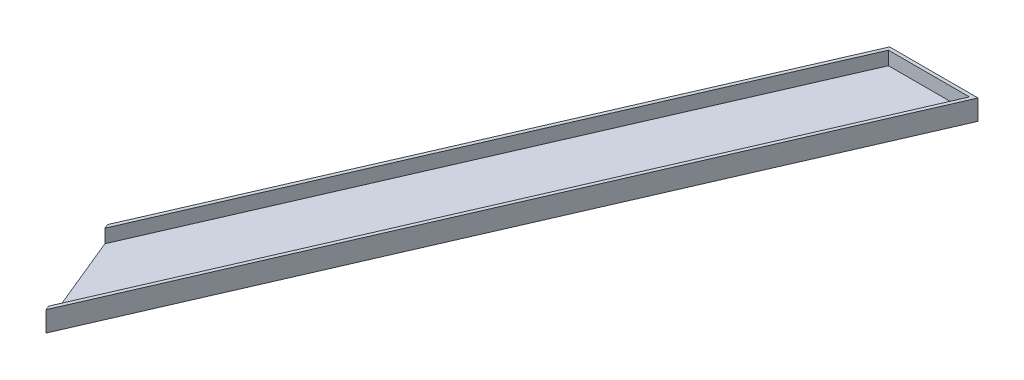
ISO-10303-21;
HEADER;
FILE_DESCRIPTION(('STEP AP214'),'2;1');
FILE_NAME('part.step','',(''),(''),'','','');
FILE_SCHEMA(('AUTOMOTIVE_DESIGN { 1 0 10303 214 1 1 1 1 }'));
ENDSEC;
DATA;
#1=APPLICATION_CONTEXT('core data for automotive mechanical design processes');
#2=APPLICATION_PROTOCOL_DEFINITION('international standard','automotive_design',2000,#1);
#3=PRODUCT_CONTEXT('',#1,'mechanical');
#4=PRODUCT('Part','Part','',(#3));
#5=PRODUCT_RELATED_PRODUCT_CATEGORY('part','',(#4));
#6=PRODUCT_DEFINITION_FORMATION('','',#4);
#7=PRODUCT_DEFINITION_CONTEXT('part definition',#1,'design');
#8=PRODUCT_DEFINITION('design','',#6,#7);
#9=PRODUCT_DEFINITION_SHAPE('','',#8);
#10=(LENGTH_UNIT() NAMED_UNIT(*) SI_UNIT(.MILLI.,.METRE.));
#11=(NAMED_UNIT(*) PLANE_ANGLE_UNIT() SI_UNIT($,.RADIAN.));
#12=(NAMED_UNIT(*) SI_UNIT($,.STERADIAN.) SOLID_ANGLE_UNIT());
#13=UNCERTAINTY_MEASURE_WITH_UNIT(LENGTH_MEASURE(1.E-05),#10,'distance_accuracy_value','');
#14=(GEOMETRIC_REPRESENTATION_CONTEXT(3) GLOBAL_UNCERTAINTY_ASSIGNED_CONTEXT((#13)) GLOBAL_UNIT_ASSIGNED_CONTEXT((#10,
#11,#12)) REPRESENTATION_CONTEXT('',''));
#15=CARTESIAN_POINT('',(0.,0.,0.));
#16=DIRECTION('',(0.,0.,1.));
#17=DIRECTION('',(1.,0.,0.));
#18=AXIS2_PLACEMENT_3D('',#15,#16,#17);
#19=CARTESIAN_POINT('',(0.,1.,0.));
#20=DIRECTION('',(0.,1.,0.));
#21=DIRECTION('',(0.,0.,1.));
#22=AXIS2_PLACEMENT_3D('',#19,#20,#21);
#23=PLANE('',#22);
#24=DIRECTION('',(0.399069158980293,0.,-0.916920828834617));
#25=VECTOR('',#24,1.);
#26=CARTESIAN_POINT('',(0.,1.,0.));
#27=LINE('',#26,#25);
#28=CARTESIAN_POINT('',(0.,1.,0.));
#29=VERTEX_POINT('',#28);
#30=CARTESIAN_POINT('',(41.3466123910746,1.,-95.));
#31=VERTEX_POINT('',#30);
#32=EDGE_CURVE('E11',#29,#31,#27,.T.);
#33=ORIENTED_EDGE('',*,*,#32,.T.);
#34=DIRECTION('',(1.,0.,0.));
#35=VECTOR('',#34,1.);
#36=CARTESIAN_POINT('',(29.349938682636,1.,-95.));
#37=LINE('',#36,#35);
#38=CARTESIAN_POINT('',(29.349938682636,1.,-95.));
#39=VERTEX_POINT('',#38);
#40=EDGE_CURVE('E49',#39,#31,#37,.T.);
#41=ORIENTED_EDGE('',*,*,#40,.F.);
#42=DIRECTION('',(0.399069158980293,0.,-0.916920828834617));
#43=VECTOR('',#42,1.);
#44=CARTESIAN_POINT('',(-5.82918270036249,1.,-14.1707291573351));
#45=LINE('',#44,#43);
#46=CARTESIAN_POINT('',(-5.82918270036249,1.,-14.1707291573351));
#47=VERTEX_POINT('',#46);
#48=EDGE_CURVE('E42',#47,#39,#45,.T.);
#49=ORIENTED_EDGE('',*,*,#48,.F.);
#50=DIRECTION('',(-0.380424828643262,0.,-0.924811845594413));
#51=VECTOR('',#50,1.);
#52=CARTESIAN_POINT('',(0.,1.,0.));
#53=LINE('',#52,#51);
#54=EDGE_CURVE('E158',#29,#47,#53,.T.);
#55=ORIENTED_EDGE('',*,*,#54,.F.);
#56=EDGE_LOOP('',(#33,#41,#49,#55));
#57=FACE_BOUND('',#56,.T.);
#58=ADVANCED_FACE('F33',(#57),#23,.T.);
#59=CARTESIAN_POINT('',(-5.82918270036249,0.,-14.1707291573351));
#60=DIRECTION('',(0.916920828834617,0.,0.399069158980293));
#61=DIRECTION('',(0.399069158980293,0.,-0.916920828834618));
#62=AXIS2_PLACEMENT_3D('',#59,#60,#61);
#63=PLANE('',#62);
#64=ORIENTED_EDGE('',*,*,#48,.T.);
#65=DIRECTION('',(0.,-1.,0.));
#66=VECTOR('',#65,1.);
#67=CARTESIAN_POINT('',(29.349938682636,15.2245170908043,-95.));
#68=LINE('',#67,#66);
#69=CARTESIAN_POINT('',(29.349938682636,3.,-95.));
#70=VERTEX_POINT('',#69);
#71=EDGE_CURVE('E56',#70,#39,#68,.T.);
#72=ORIENTED_EDGE('',*,*,#71,.F.);
#73=DIRECTION('',(0.399069158980293,0.,-0.916920828834617));
#74=VECTOR('',#73,1.);
#75=CARTESIAN_POINT('',(-5.82918270036249,3.,-14.1707291573351));
#76=LINE('',#75,#74);
#77=CARTESIAN_POINT('',(-5.82918270036249,3.,-14.1707291573351));
#78=VERTEX_POINT('',#77);
#79=EDGE_CURVE('E147',#78,#70,#76,.T.);
#80=ORIENTED_EDGE('',*,*,#79,.F.);
#81=DIRECTION('',(0.,1.,0.));
#82=VECTOR('',#81,1.);
#83=CARTESIAN_POINT('',(-5.82918270036249,0.,-14.1707291573351));
#84=LINE('',#83,#82);
#85=EDGE_CURVE('E152',#47,#78,#84,.T.);
#86=ORIENTED_EDGE('',*,*,#85,.F.);
#87=EDGE_LOOP('',(#64,#72,#80,#86));
#88=FACE_BOUND('',#87,.T.);
#89=ADVANCED_FACE('F176',(#88),#63,.T.);
#90=CARTESIAN_POINT('',(0.,0.,0.));
#91=DIRECTION('',(0.916920828834617,0.,0.399069158980293));
#92=DIRECTION('',(0.399069158980293,0.,-0.916920828834617));
#93=AXIS2_PLACEMENT_3D('',#90,#91,#92);
#94=PLANE('',#93);
#95=DIRECTION('',(0.,-1.,0.));
#96=VECTOR('',#95,1.);
#97=CARTESIAN_POINT('',(41.3466123910747,15.2245170908043,-95.));
#98=LINE('',#97,#96);
#99=CARTESIAN_POINT('',(41.3466123910746,3.,-95.));
#100=VERTEX_POINT('',#99);
#101=EDGE_CURVE('E196',#100,#31,#98,.T.);
#102=ORIENTED_EDGE('',*,*,#101,.T.);
#103=ORIENTED_EDGE('',*,*,#32,.F.);
#104=DIRECTION('',(0.,1.,0.));
#105=VECTOR('',#104,1.);
#106=CARTESIAN_POINT('',(0.,0.,0.));
#107=LINE('',#106,#105);
#108=CARTESIAN_POINT('',(0.,3.,0.));
#109=VERTEX_POINT('',#108);
#110=EDGE_CURVE('E140',#29,#109,#107,.T.);
#111=ORIENTED_EDGE('',*,*,#110,.T.);
#112=DIRECTION('',(0.399069158980293,0.,-0.916920828834617));
#113=VECTOR('',#112,1.);
#114=CARTESIAN_POINT('',(0.,3.,0.));
#115=LINE('',#114,#113);
#116=EDGE_CURVE('E131',#109,#100,#115,.T.);
#117=ORIENTED_EDGE('',*,*,#116,.T.);
#118=EDGE_LOOP('',(#102,#103,#111,#117));
#119=FACE_BOUND('',#118,.T.);
#120=ADVANCED_FACE('F180',(#119),#94,.F.);
#121=CARTESIAN_POINT('',(0.,1.,0.));
#122=DIRECTION('',(-0.924811845594413,0.,0.380424828643262));
#123=DIRECTION('',(0.380424828643262,0.,0.924811845594414));
#124=AXIS2_PLACEMENT_3D('',#121,#122,#123);
#125=PLANE('',#124);
#126=DIRECTION('',(-0.380424828643262,0.,-0.924811845594413));
#127=VECTOR('',#126,1.);
#128=CARTESIAN_POINT('',(0.,0.,0.));
#129=LINE('',#128,#127);
#130=CARTESIAN_POINT('',(0.264962850016483,0.,0.644124052606153));
#131=VERTEX_POINT('',#130);
#132=CARTESIAN_POINT('',(-6.09414555037896,0.,-14.8148532099412));
#133=VERTEX_POINT('',#132);
#134=EDGE_CURVE('E154',#131,#133,#129,.T.);
#135=ORIENTED_EDGE('',*,*,#134,.F.);
#136=DIRECTION('',(0.,1.,0.));
#137=VECTOR('',#136,1.);
#138=CARTESIAN_POINT('',(0.264962850016483,0.,0.644124052606153));
#139=LINE('',#138,#137);
#140=CARTESIAN_POINT('',(0.264962850016483,3.,0.644124052606153));
#141=VERTEX_POINT('',#140);
#142=EDGE_CURVE('E122',#131,#141,#139,.T.);
#143=ORIENTED_EDGE('',*,*,#142,.T.);
#144=DIRECTION('',(0.380424828643262,0.,0.924811845594413));
#145=VECTOR('',#144,1.);
#146=CARTESIAN_POINT('',(0.,3.,0.));
#147=LINE('',#146,#145);
#148=EDGE_CURVE('E128',#109,#141,#147,.T.);
#149=ORIENTED_EDGE('',*,*,#148,.F.);
#150=ORIENTED_EDGE('',*,*,#110,.F.);
#151=ORIENTED_EDGE('',*,*,#54,.T.);
#152=ORIENTED_EDGE('',*,*,#85,.T.);
#153=DIRECTION('',(-0.380424828643263,0.,-0.924811845594413));
#154=VECTOR('',#153,1.);
#155=CARTESIAN_POINT('',(-5.82918270036249,3.,-14.1707291573351));
#156=LINE('',#155,#154);
#157=CARTESIAN_POINT('',(-6.09414555037896,3.,-14.8148532099412));
#158=VERTEX_POINT('',#157);
#159=EDGE_CURVE('E144',#78,#158,#156,.T.);
#160=ORIENTED_EDGE('',*,*,#159,.T.);
#161=DIRECTION('',(0.,1.,0.));
#162=VECTOR('',#161,1.);
#163=CARTESIAN_POINT('',(-6.09414555037896,0.,-14.8148532099412));
#164=LINE('',#163,#162);
#165=EDGE_CURVE('E155',#133,#158,#164,.T.);
#166=ORIENTED_EDGE('',*,*,#165,.F.);
#167=EDGE_LOOP('',(#135,#143,#149,#150,#151,#152,#160,#166));
#168=FACE_BOUND('',#167,.T.);
#169=ADVANCED_FACE('F35',(#168),#125,.T.);
#170=CARTESIAN_POINT('',(41.5642261405013,1.,-95.5));
#171=DIRECTION('',(0.,0.,1.));
#172=DIRECTION('',(1.,0.,0.));
#173=AXIS2_PLACEMENT_3D('',#170,#171,#172);
#174=PLANE('',#173);
#175=DIRECTION('',(-1.,0.,0.));
#176=VECTOR('',#175,1.);
#177=CARTESIAN_POINT('',(29.5675524320627,3.,-95.5));
#178=LINE('',#177,#176);
#179=CARTESIAN_POINT('',(42.1095294908849,3.,-95.5));
#180=VERTEX_POINT('',#179);
#181=CARTESIAN_POINT('',(29.0222490816792,3.,-95.5));
#182=VERTEX_POINT('',#181);
#183=EDGE_CURVE('E102',#180,#182,#178,.T.);
#184=ORIENTED_EDGE('',*,*,#183,.F.);
#185=DIRECTION('',(0.,1.,0.));
#186=VECTOR('',#185,1.);
#187=CARTESIAN_POINT('',(42.1095294908849,0.,-95.5));
#188=LINE('',#187,#186);
#189=CARTESIAN_POINT('',(42.1095294908849,0.,-95.5));
#190=VERTEX_POINT('',#189);
#191=EDGE_CURVE('E105',#190,#180,#188,.T.);
#192=ORIENTED_EDGE('',*,*,#191,.F.);
#193=DIRECTION('',(-1.,0.,0.));
#194=VECTOR('',#193,1.);
#195=CARTESIAN_POINT('',(41.5642261405013,0.,-95.5));
#196=LINE('',#195,#194);
#197=CARTESIAN_POINT('',(29.0222490816792,0.,-95.5));
#198=VERTEX_POINT('',#197);
#199=EDGE_CURVE('E37',#190,#198,#196,.T.);
#200=ORIENTED_EDGE('',*,*,#199,.T.);
#201=DIRECTION('',(0.,1.,0.));
#202=VECTOR('',#201,1.);
#203=CARTESIAN_POINT('',(29.0222490816792,0.,-95.5));
#204=LINE('',#203,#202);
#205=EDGE_CURVE('E107',#198,#182,#204,.T.);
#206=ORIENTED_EDGE('',*,*,#205,.T.);
#207=EDGE_LOOP('',(#184,#192,#200,#206));
#208=FACE_BOUND('',#207,.T.);
#209=ADVANCED_FACE('F104',(#208),#174,.F.);
#210=CARTESIAN_POINT('',(0.,0.,0.));
#211=DIRECTION('',(0.,1.,0.));
#212=DIRECTION('',(0.,0.,1.));
#213=AXIS2_PLACEMENT_3D('',#210,#211,#212);
#214=PLANE('',#213);
#215=ORIENTED_EDGE('',*,*,#134,.T.);
#216=DIRECTION('',(-0.399069158980293,0.,0.916920828834618));
#217=VECTOR('',#216,1.);
#218=CARTESIAN_POINT('',(29.0222490816792,0.,-95.5));
#219=LINE('',#218,#217);
#220=EDGE_CURVE('E149',#198,#133,#219,.T.);
#221=ORIENTED_EDGE('',*,*,#220,.F.);
#222=ORIENTED_EDGE('',*,*,#199,.F.);
#223=DIRECTION('',(-0.399069158980293,0.,0.916920828834617));
#224=VECTOR('',#223,1.);
#225=CARTESIAN_POINT('',(42.1095294908849,0.,-95.5));
#226=LINE('',#225,#224);
#227=EDGE_CURVE('E121',#190,#131,#226,.T.);
#228=ORIENTED_EDGE('',*,*,#227,.T.);
#229=EDGE_LOOP('',(#215,#221,#222,#228));
#230=FACE_BOUND('',#229,.T.);
#231=ADVANCED_FACE('F166',(#230),#214,.F.);
#232=CARTESIAN_POINT('',(29.0222490816792,0.,-95.5));
#233=DIRECTION('',(-0.916920828834617,0.,-0.399069158980293));
#234=DIRECTION('',(-0.399069158980293,0.,0.916920828834618));
#235=AXIS2_PLACEMENT_3D('',#232,#233,#234);
#236=PLANE('',#235);
#237=ORIENTED_EDGE('',*,*,#165,.T.);
#238=DIRECTION('',(-0.399069158980293,0.,0.916920828834618));
#239=VECTOR('',#238,1.);
#240=CARTESIAN_POINT('',(29.0222490816792,3.,-95.5));
#241=LINE('',#240,#239);
#242=EDGE_CURVE('E112',#182,#158,#241,.T.);
#243=ORIENTED_EDGE('',*,*,#242,.F.);
#244=ORIENTED_EDGE('',*,*,#205,.F.);
#245=ORIENTED_EDGE('',*,*,#220,.T.);
#246=EDGE_LOOP('',(#237,#243,#244,#245));
#247=FACE_BOUND('',#246,.T.);
#248=ADVANCED_FACE('F165',(#247),#236,.T.);
#249=CARTESIAN_POINT('',(0.,3.,0.));
#250=DIRECTION('',(0.,-1.,0.));
#251=DIRECTION('',(0.,0.,-1.));
#252=AXIS2_PLACEMENT_3D('',#249,#250,#251);
#253=PLANE('',#252);
#254=ORIENTED_EDGE('',*,*,#183,.T.);
#255=ORIENTED_EDGE('',*,*,#242,.T.);
#256=ORIENTED_EDGE('',*,*,#159,.F.);
#257=ORIENTED_EDGE('',*,*,#79,.T.);
#258=DIRECTION('',(-1.,0.,0.));
#259=VECTOR('',#258,1.);
#260=CARTESIAN_POINT('',(29.349938682636,3.,-95.));
#261=LINE('',#260,#259);
#262=EDGE_CURVE('E129',#100,#70,#261,.T.);
#263=ORIENTED_EDGE('',*,*,#262,.F.);
#264=ORIENTED_EDGE('',*,*,#116,.F.);
#265=ORIENTED_EDGE('',*,*,#148,.T.);
#266=DIRECTION('',(-0.399069158980293,0.,0.916920828834617));
#267=VECTOR('',#266,1.);
#268=CARTESIAN_POINT('',(42.1095294908849,3.,-95.5));
#269=LINE('',#268,#267);
#270=EDGE_CURVE('E119',#180,#141,#269,.T.);
#271=ORIENTED_EDGE('',*,*,#270,.F.);
#272=EDGE_LOOP('',(#254,#255,#256,#257,#263,#264,#265,#271));
#273=FACE_BOUND('',#272,.T.);
#274=ADVANCED_FACE('F125',(#273),#253,.F.);
#275=CARTESIAN_POINT('',(42.1095294908849,0.,-95.5));
#276=DIRECTION('',(-0.916920828834617,0.,-0.399069158980293));
#277=DIRECTION('',(-0.399069158980293,0.,0.916920828834617));
#278=AXIS2_PLACEMENT_3D('',#275,#276,#277);
#279=PLANE('',#278);
#280=ORIENTED_EDGE('',*,*,#191,.T.);
#281=ORIENTED_EDGE('',*,*,#270,.T.);
#282=ORIENTED_EDGE('',*,*,#142,.F.);
#283=ORIENTED_EDGE('',*,*,#227,.F.);
#284=EDGE_LOOP('',(#280,#281,#282,#283));
#285=FACE_BOUND('',#284,.T.);
#286=ADVANCED_FACE('F117',(#285),#279,.F.);
#287=CARTESIAN_POINT('',(29.349938682636,15.2245170908043,-95.));
#288=DIRECTION('',(0.,0.,-1.));
#289=DIRECTION('',(-1.,0.,0.));
#290=AXIS2_PLACEMENT_3D('',#287,#288,#289);
#291=PLANE('',#290);
#292=ORIENTED_EDGE('',*,*,#101,.F.);
#293=ORIENTED_EDGE('',*,*,#262,.T.);
#294=ORIENTED_EDGE('',*,*,#71,.T.);
#295=ORIENTED_EDGE('',*,*,#40,.T.);
#296=EDGE_LOOP('',(#292,#293,#294,#295));
#297=FACE_BOUND('',#296,.T.);
#298=ADVANCED_FACE('F187',(#297),#291,.F.);
#299=CLOSED_SHELL('',(#58,#89,#120,#169,#209,#231,#248,#274,#286,#298));
#300=MANIFOLD_SOLID_BREP('B2',#299);
#301=ADVANCED_BREP_SHAPE_REPRESENTATION('',(#18,#300),#14);
#302=SHAPE_DEFINITION_REPRESENTATION(#9,#301);
ENDSEC;
END-ISO-10303-21;
